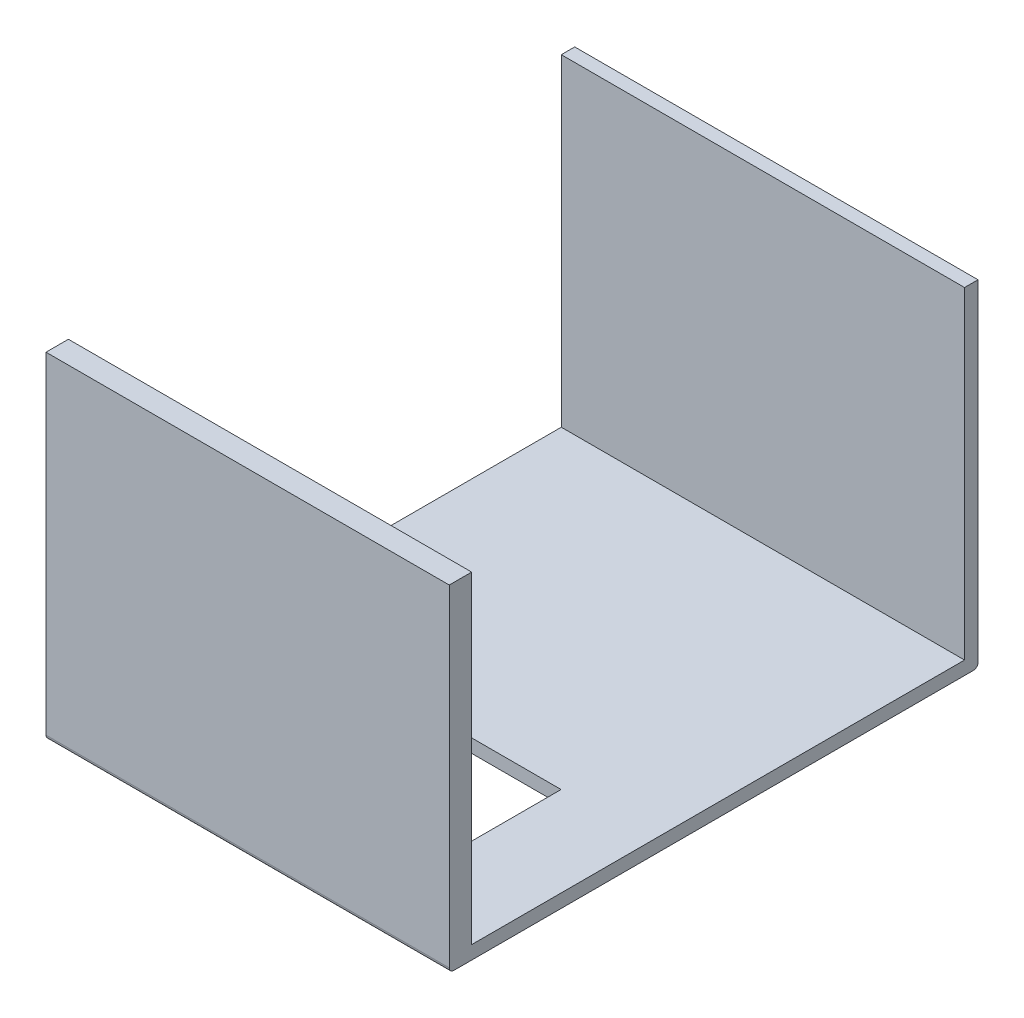
ISO-10303-21;
HEADER;
FILE_DESCRIPTION(('STEP AP214'),'2;1');
FILE_NAME('part.step','',(''),(''),'','','');
FILE_SCHEMA(('AUTOMOTIVE_DESIGN { 1 0 10303 214 1 1 1 1 }'));
ENDSEC;
DATA;
#1=APPLICATION_CONTEXT('core data for automotive mechanical design processes');
#2=APPLICATION_PROTOCOL_DEFINITION('international standard','automotive_design',2000,#1);
#3=PRODUCT_CONTEXT('',#1,'mechanical');
#4=PRODUCT('Part','Part','',(#3));
#5=PRODUCT_RELATED_PRODUCT_CATEGORY('part','',(#4));
#6=PRODUCT_DEFINITION_FORMATION('','',#4);
#7=PRODUCT_DEFINITION_CONTEXT('part definition',#1,'design');
#8=PRODUCT_DEFINITION('design','',#6,#7);
#9=PRODUCT_DEFINITION_SHAPE('','',#8);
#10=(LENGTH_UNIT() NAMED_UNIT(*) SI_UNIT(.MILLI.,.METRE.));
#11=(NAMED_UNIT(*) PLANE_ANGLE_UNIT() SI_UNIT($,.RADIAN.));
#12=(NAMED_UNIT(*) SI_UNIT($,.STERADIAN.) SOLID_ANGLE_UNIT());
#13=UNCERTAINTY_MEASURE_WITH_UNIT(LENGTH_MEASURE(1.E-05),#10,'distance_accuracy_value','');
#14=(GEOMETRIC_REPRESENTATION_CONTEXT(3) GLOBAL_UNCERTAINTY_ASSIGNED_CONTEXT((#13)) GLOBAL_UNIT_ASSIGNED_CONTEXT((#10,
#11,#12)) REPRESENTATION_CONTEXT('',''));
#15=CARTESIAN_POINT('',(0.,0.,0.));
#16=DIRECTION('',(0.,0.,1.));
#17=DIRECTION('',(1.,0.,0.));
#18=AXIS2_PLACEMENT_3D('',#15,#16,#17);
#19=CARTESIAN_POINT('',(0.,3.,0.));
#20=DIRECTION('',(1.,0.,0.));
#21=DIRECTION('',(0.,0.,-1.));
#22=AXIS2_PLACEMENT_3D('',#19,#20,#21);
#23=PLANE('',#22);
#24=DIRECTION('',(0.,0.,1.));
#25=VECTOR('',#24,1.);
#26=CARTESIAN_POINT('',(0.,0.,0.));
#27=LINE('',#26,#25);
#28=CARTESIAN_POINT('',(0.,0.,-112.));
#29=VERTEX_POINT('',#28);
#30=CARTESIAN_POINT('',(0.,0.,4.));
#31=VERTEX_POINT('',#30);
#32=EDGE_CURVE('E214',#29,#31,#27,.T.);
#33=ORIENTED_EDGE('',*,*,#32,.T.);
#34=CARTESIAN_POINT('',(0.,1.,4.));
#35=DIRECTION('',(1.,0.,0.));
#36=DIRECTION('',(0.,0.,-1.));
#37=AXIS2_PLACEMENT_3D('',#34,#35,#36);
#38=CIRCLE('',#37,1.);
#39=CARTESIAN_POINT('',(0.,1.,5.));
#40=VERTEX_POINT('',#39);
#41=EDGE_CURVE('E41',#31,#40,#38,.F.);
#42=ORIENTED_EDGE('',*,*,#41,.T.);
#43=DIRECTION('',(0.,-1.,0.));
#44=VECTOR('',#43,1.);
#45=CARTESIAN_POINT('',(0.,0.,5.));
#46=LINE('',#45,#44);
#47=CARTESIAN_POINT('',(0.,75.,5.));
#48=VERTEX_POINT('',#47);
#49=EDGE_CURVE('E171',#48,#40,#46,.T.);
#50=ORIENTED_EDGE('',*,*,#49,.F.);
#51=DIRECTION('',(0.,0.,-1.));
#52=VECTOR('',#51,1.);
#53=CARTESIAN_POINT('',(0.,75.,5.));
#54=LINE('',#53,#52);
#55=CARTESIAN_POINT('',(0.,75.,0.));
#56=VERTEX_POINT('',#55);
#57=EDGE_CURVE('E179',#48,#56,#54,.T.);
#58=ORIENTED_EDGE('',*,*,#57,.T.);
#59=DIRECTION('',(0.,-1.,0.));
#60=VECTOR('',#59,1.);
#61=CARTESIAN_POINT('',(0.,0.,0.));
#62=LINE('',#61,#60);
#63=CARTESIAN_POINT('',(0.,3.,0.));
#64=VERTEX_POINT('',#63);
#65=EDGE_CURVE('E151',#56,#64,#62,.T.);
#66=ORIENTED_EDGE('',*,*,#65,.T.);
#67=DIRECTION('',(0.,0.,1.));
#68=VECTOR('',#67,1.);
#69=CARTESIAN_POINT('',(0.,3.,0.));
#70=LINE('',#69,#68);
#71=CARTESIAN_POINT('',(0.,3.,-110.));
#72=VERTEX_POINT('',#71);
#73=EDGE_CURVE('E235',#72,#64,#70,.T.);
#74=ORIENTED_EDGE('',*,*,#73,.F.);
#75=DIRECTION('',(0.,1.,0.));
#76=VECTOR('',#75,1.);
#77=CARTESIAN_POINT('',(0.,0.,-110.));
#78=LINE('',#77,#76);
#79=CARTESIAN_POINT('',(0.,75.,-110.));
#80=VERTEX_POINT('',#79);
#81=EDGE_CURVE('E148',#72,#80,#78,.T.);
#82=ORIENTED_EDGE('',*,*,#81,.T.);
#83=DIRECTION('',(0.,0.,1.));
#84=VECTOR('',#83,1.);
#85=CARTESIAN_POINT('',(0.,75.,-113.));
#86=LINE('',#85,#84);
#87=CARTESIAN_POINT('',(0.,75.,-113.));
#88=VERTEX_POINT('',#87);
#89=EDGE_CURVE('E146',#88,#80,#86,.T.);
#90=ORIENTED_EDGE('',*,*,#89,.F.);
#91=DIRECTION('',(0.,1.,0.));
#92=VECTOR('',#91,1.);
#93=CARTESIAN_POINT('',(0.,0.,-113.));
#94=LINE('',#93,#92);
#95=CARTESIAN_POINT('',(0.,1.,-113.));
#96=VERTEX_POINT('',#95);
#97=EDGE_CURVE('E135',#96,#88,#94,.T.);
#98=ORIENTED_EDGE('',*,*,#97,.F.);
#99=CARTESIAN_POINT('',(0.,1.,-112.));
#100=DIRECTION('',(1.,0.,0.));
#101=DIRECTION('',(0.,0.,-1.));
#102=AXIS2_PLACEMENT_3D('',#99,#100,#101);
#103=CIRCLE('',#102,1.);
#104=EDGE_CURVE('E48',#96,#29,#103,.F.);
#105=ORIENTED_EDGE('',*,*,#104,.T.);
#106=EDGE_LOOP('',(#33,#42,#50,#58,#66,#74,#82,#90,#98,#105));
#107=FACE_BOUND('',#106,.T.);
#108=ADVANCED_FACE('F33',(#107),#23,.F.);
#109=CARTESIAN_POINT('',(90.,3.,0.));
#110=DIRECTION('',(-1.,0.,0.));
#111=DIRECTION('',(0.,0.,1.));
#112=AXIS2_PLACEMENT_3D('',#109,#110,#111);
#113=PLANE('',#112);
#114=DIRECTION('',(0.,1.,0.));
#115=VECTOR('',#114,1.);
#116=CARTESIAN_POINT('',(90.,0.,5.));
#117=LINE('',#116,#115);
#118=CARTESIAN_POINT('',(90.,1.,5.));
#119=VERTEX_POINT('',#118);
#120=CARTESIAN_POINT('',(90.,75.,5.));
#121=VERTEX_POINT('',#120);
#122=EDGE_CURVE('E174',#119,#121,#117,.T.);
#123=ORIENTED_EDGE('',*,*,#122,.F.);
#124=CARTESIAN_POINT('',(90.,1.,4.));
#125=DIRECTION('',(-1.,0.,0.));
#126=DIRECTION('',(0.,0.,1.));
#127=AXIS2_PLACEMENT_3D('',#124,#125,#126);
#128=CIRCLE('',#127,1.);
#129=CARTESIAN_POINT('',(90.,0.,4.));
#130=VERTEX_POINT('',#129);
#131=EDGE_CURVE('E247',#119,#130,#128,.F.);
#132=ORIENTED_EDGE('',*,*,#131,.T.);
#133=DIRECTION('',(0.,0.,-1.));
#134=VECTOR('',#133,1.);
#135=CARTESIAN_POINT('',(90.,0.,0.));
#136=LINE('',#135,#134);
#137=CARTESIAN_POINT('',(90.,0.,-112.));
#138=VERTEX_POINT('',#137);
#139=EDGE_CURVE('E234',#130,#138,#136,.T.);
#140=ORIENTED_EDGE('',*,*,#139,.T.);
#141=CARTESIAN_POINT('',(90.,1.,-112.));
#142=DIRECTION('',(-1.,0.,0.));
#143=DIRECTION('',(0.,0.,1.));
#144=AXIS2_PLACEMENT_3D('',#141,#142,#143);
#145=CIRCLE('',#144,1.);
#146=CARTESIAN_POINT('',(90.,1.,-113.));
#147=VERTEX_POINT('',#146);
#148=EDGE_CURVE('E245',#138,#147,#145,.F.);
#149=ORIENTED_EDGE('',*,*,#148,.T.);
#150=DIRECTION('',(0.,-1.,0.));
#151=VECTOR('',#150,1.);
#152=CARTESIAN_POINT('',(90.,0.,-113.));
#153=LINE('',#152,#151);
#154=CARTESIAN_POINT('',(90.,75.,-113.));
#155=VERTEX_POINT('',#154);
#156=EDGE_CURVE('E143',#155,#147,#153,.T.);
#157=ORIENTED_EDGE('',*,*,#156,.F.);
#158=DIRECTION('',(0.,0.,1.));
#159=VECTOR('',#158,1.);
#160=CARTESIAN_POINT('',(90.,75.,-113.));
#161=LINE('',#160,#159);
#162=CARTESIAN_POINT('',(90.,75.,-110.));
#163=VERTEX_POINT('',#162);
#164=EDGE_CURVE('E152',#155,#163,#161,.T.);
#165=ORIENTED_EDGE('',*,*,#164,.T.);
#166=DIRECTION('',(0.,-1.,0.));
#167=VECTOR('',#166,1.);
#168=CARTESIAN_POINT('',(90.,0.,-110.));
#169=LINE('',#168,#167);
#170=CARTESIAN_POINT('',(90.,3.,-110.));
#171=VERTEX_POINT('',#170);
#172=EDGE_CURVE('E166',#163,#171,#169,.T.);
#173=ORIENTED_EDGE('',*,*,#172,.T.);
#174=DIRECTION('',(0.,0.,-1.));
#175=VECTOR('',#174,1.);
#176=CARTESIAN_POINT('',(90.,3.,0.));
#177=LINE('',#176,#175);
#178=CARTESIAN_POINT('',(90.,3.,0.));
#179=VERTEX_POINT('',#178);
#180=EDGE_CURVE('E224',#179,#171,#177,.T.);
#181=ORIENTED_EDGE('',*,*,#180,.F.);
#182=DIRECTION('',(0.,1.,0.));
#183=VECTOR('',#182,1.);
#184=CARTESIAN_POINT('',(90.,0.,0.));
#185=LINE('',#184,#183);
#186=CARTESIAN_POINT('',(90.,75.,0.));
#187=VERTEX_POINT('',#186);
#188=EDGE_CURVE('E185',#179,#187,#185,.T.);
#189=ORIENTED_EDGE('',*,*,#188,.T.);
#190=DIRECTION('',(0.,0.,-1.));
#191=VECTOR('',#190,1.);
#192=CARTESIAN_POINT('',(90.,75.,5.));
#193=LINE('',#192,#191);
#194=EDGE_CURVE('E190',#121,#187,#193,.T.);
#195=ORIENTED_EDGE('',*,*,#194,.F.);
#196=EDGE_LOOP('',(#123,#132,#140,#149,#157,#165,#173,#181,#189,#195));
#197=FACE_BOUND('',#196,.T.);
#198=ADVANCED_FACE('F264',(#197),#113,.F.);
#199=CARTESIAN_POINT('',(0.,3.,0.));
#200=DIRECTION('',(0.,-1.,0.));
#201=DIRECTION('',(0.,0.,-1.));
#202=AXIS2_PLACEMENT_3D('',#199,#200,#201);
#203=PLANE('',#202);
#204=DIRECTION('',(1.,0.,0.));
#205=VECTOR('',#204,1.);
#206=CARTESIAN_POINT('',(0.,3.,0.));
#207=LINE('',#206,#205);
#208=CARTESIAN_POINT('',(20.,3.,0.));
#209=VERTEX_POINT('',#208);
#210=EDGE_CURVE('E222',#64,#209,#207,.T.);
#211=ORIENTED_EDGE('',*,*,#210,.T.);
#212=DIRECTION('',(0.,0.,1.));
#213=VECTOR('',#212,1.);
#214=CARTESIAN_POINT('',(20.,3.,0.));
#215=LINE('',#214,#213);
#216=CARTESIAN_POINT('',(20.,3.,-39.9514874047836));
#217=VERTEX_POINT('',#216);
#218=EDGE_CURVE('E193',#217,#209,#215,.T.);
#219=ORIENTED_EDGE('',*,*,#218,.F.);
#220=DIRECTION('',(-1.,0.,0.));
#221=VECTOR('',#220,1.);
#222=CARTESIAN_POINT('',(20.,3.,-39.9514874047836));
#223=LINE('',#222,#221);
#224=CARTESIAN_POINT('',(70.,3.,-39.9514874047836));
#225=VERTEX_POINT('',#224);
#226=EDGE_CURVE('E198',#225,#217,#223,.T.);
#227=ORIENTED_EDGE('',*,*,#226,.F.);
#228=DIRECTION('',(0.,0.,-1.));
#229=VECTOR('',#228,1.);
#230=CARTESIAN_POINT('',(70.,3.,0.));
#231=LINE('',#230,#229);
#232=CARTESIAN_POINT('',(70.,3.,0.));
#233=VERTEX_POINT('',#232);
#234=EDGE_CURVE('E207',#233,#225,#231,.T.);
#235=ORIENTED_EDGE('',*,*,#234,.F.);
#236=EDGE_CURVE('E225',#233,#179,#207,.T.);
#237=ORIENTED_EDGE('',*,*,#236,.T.);
#238=ORIENTED_EDGE('',*,*,#180,.T.);
#239=DIRECTION('',(-1.,0.,0.));
#240=VECTOR('',#239,1.);
#241=CARTESIAN_POINT('',(0.,3.,-110.));
#242=LINE('',#241,#240);
#243=EDGE_CURVE('E230',#171,#72,#242,.T.);
#244=ORIENTED_EDGE('',*,*,#243,.T.);
#245=ORIENTED_EDGE('',*,*,#73,.T.);
#246=EDGE_LOOP('',(#211,#219,#227,#235,#237,#238,#244,#245));
#247=FACE_BOUND('',#246,.T.);
#248=ADVANCED_FACE('F273',(#247),#203,.F.);
#249=CARTESIAN_POINT('',(0.,0.,0.));
#250=DIRECTION('',(0.,-1.,0.));
#251=DIRECTION('',(0.,0.,-1.));
#252=AXIS2_PLACEMENT_3D('',#249,#250,#251);
#253=PLANE('',#252);
#254=DIRECTION('',(0.,0.,1.));
#255=VECTOR('',#254,1.);
#256=CARTESIAN_POINT('',(20.,0.,0.));
#257=LINE('',#256,#255);
#258=CARTESIAN_POINT('',(20.,0.,-39.9514874047836));
#259=VERTEX_POINT('',#258);
#260=CARTESIAN_POINT('',(20.,0.,0.));
#261=VERTEX_POINT('',#260);
#262=EDGE_CURVE('E194',#259,#261,#257,.T.);
#263=ORIENTED_EDGE('',*,*,#262,.T.);
#264=DIRECTION('',(1.,0.,0.));
#265=VECTOR('',#264,1.);
#266=CARTESIAN_POINT('',(0.,0.,0.));
#267=LINE('',#266,#265);
#268=CARTESIAN_POINT('',(70.,0.,0.));
#269=VERTEX_POINT('',#268);
#270=EDGE_CURVE('E182',#261,#269,#267,.T.);
#271=ORIENTED_EDGE('',*,*,#270,.T.);
#272=DIRECTION('',(0.,0.,-1.));
#273=VECTOR('',#272,1.);
#274=CARTESIAN_POINT('',(70.,0.,0.));
#275=LINE('',#274,#273);
#276=CARTESIAN_POINT('',(70.,0.,-39.9514874047836));
#277=VERTEX_POINT('',#276);
#278=EDGE_CURVE('E197',#269,#277,#275,.T.);
#279=ORIENTED_EDGE('',*,*,#278,.T.);
#280=DIRECTION('',(-1.,0.,0.));
#281=VECTOR('',#280,1.);
#282=CARTESIAN_POINT('',(20.,0.,-39.9514874047836));
#283=LINE('',#282,#281);
#284=EDGE_CURVE('E201',#277,#259,#283,.T.);
#285=ORIENTED_EDGE('',*,*,#284,.T.);
#286=EDGE_LOOP('',(#263,#271,#279,#285));
#287=FACE_BOUND('',#286,.T.);
#288=ORIENTED_EDGE('',*,*,#139,.F.);
#289=DIRECTION('',(1.,0.,0.));
#290=VECTOR('',#289,1.);
#291=CARTESIAN_POINT('',(0.,0.,4.));
#292=LINE('',#291,#290);
#293=EDGE_CURVE('E55',#130,#31,#292,.F.);
#294=ORIENTED_EDGE('',*,*,#293,.T.);
#295=ORIENTED_EDGE('',*,*,#32,.F.);
#296=DIRECTION('',(-1.,0.,0.));
#297=VECTOR('',#296,1.);
#298=CARTESIAN_POINT('',(90.,0.,-112.));
#299=LINE('',#298,#297);
#300=EDGE_CURVE('E249',#29,#138,#299,.F.);
#301=ORIENTED_EDGE('',*,*,#300,.T.);
#302=EDGE_LOOP('',(#288,#294,#295,#301));
#303=FACE_BOUND('',#302,.T.);
#304=ADVANCED_FACE('F267',(#287,#303),#253,.T.);
#305=CARTESIAN_POINT('',(20.,0.,0.));
#306=DIRECTION('',(-1.,0.,0.));
#307=DIRECTION('',(0.,0.,1.));
#308=AXIS2_PLACEMENT_3D('',#305,#306,#307);
#309=PLANE('',#308);
#310=ORIENTED_EDGE('',*,*,#218,.T.);
#311=DIRECTION('',(0.,1.,0.));
#312=VECTOR('',#311,1.);
#313=CARTESIAN_POINT('',(20.,0.,0.));
#314=LINE('',#313,#312);
#315=EDGE_CURVE('E204',#261,#209,#314,.T.);
#316=ORIENTED_EDGE('',*,*,#315,.F.);
#317=ORIENTED_EDGE('',*,*,#262,.F.);
#318=DIRECTION('',(0.,1.,0.));
#319=VECTOR('',#318,1.);
#320=CARTESIAN_POINT('',(20.,0.,-39.9514874047836));
#321=LINE('',#320,#319);
#322=EDGE_CURVE('E212',#259,#217,#321,.T.);
#323=ORIENTED_EDGE('',*,*,#322,.T.);
#324=EDGE_LOOP('',(#310,#316,#317,#323));
#325=FACE_BOUND('',#324,.T.);
#326=ADVANCED_FACE('F284',(#325),#309,.F.);
#327=CARTESIAN_POINT('',(20.,0.,-39.9514874047836));
#328=DIRECTION('',(0.,0.,-1.));
#329=DIRECTION('',(-1.,0.,0.));
#330=AXIS2_PLACEMENT_3D('',#327,#328,#329);
#331=PLANE('',#330);
#332=ORIENTED_EDGE('',*,*,#226,.T.);
#333=ORIENTED_EDGE('',*,*,#322,.F.);
#334=ORIENTED_EDGE('',*,*,#284,.F.);
#335=DIRECTION('',(0.,1.,0.));
#336=VECTOR('',#335,1.);
#337=CARTESIAN_POINT('',(70.,0.,-39.9514874047836));
#338=LINE('',#337,#336);
#339=EDGE_CURVE('E215',#277,#225,#338,.T.);
#340=ORIENTED_EDGE('',*,*,#339,.T.);
#341=EDGE_LOOP('',(#332,#333,#334,#340));
#342=FACE_BOUND('',#341,.T.);
#343=ADVANCED_FACE('F287',(#342),#331,.F.);
#344=CARTESIAN_POINT('',(70.,0.,0.));
#345=DIRECTION('',(1.,0.,0.));
#346=DIRECTION('',(0.,0.,-1.));
#347=AXIS2_PLACEMENT_3D('',#344,#345,#346);
#348=PLANE('',#347);
#349=ORIENTED_EDGE('',*,*,#234,.T.);
#350=ORIENTED_EDGE('',*,*,#339,.F.);
#351=ORIENTED_EDGE('',*,*,#278,.F.);
#352=DIRECTION('',(0.,1.,0.));
#353=VECTOR('',#352,1.);
#354=CARTESIAN_POINT('',(70.,0.,0.));
#355=LINE('',#354,#353);
#356=EDGE_CURVE('E217',#269,#233,#355,.T.);
#357=ORIENTED_EDGE('',*,*,#356,.T.);
#358=EDGE_LOOP('',(#349,#350,#351,#357));
#359=FACE_BOUND('',#358,.T.);
#360=ADVANCED_FACE('F291',(#359),#348,.F.);
#361=CARTESIAN_POINT('',(0.,0.,0.));
#362=DIRECTION('',(0.,0.,-1.));
#363=DIRECTION('',(-1.,0.,0.));
#364=AXIS2_PLACEMENT_3D('',#361,#362,#363);
#365=PLANE('',#364);
#366=ORIENTED_EDGE('',*,*,#210,.F.);
#367=ORIENTED_EDGE('',*,*,#65,.F.);
#368=DIRECTION('',(-1.,0.,0.));
#369=VECTOR('',#368,1.);
#370=CARTESIAN_POINT('',(0.,75.,0.));
#371=LINE('',#370,#369);
#372=EDGE_CURVE('E175',#187,#56,#371,.T.);
#373=ORIENTED_EDGE('',*,*,#372,.F.);
#374=ORIENTED_EDGE('',*,*,#188,.F.);
#375=ORIENTED_EDGE('',*,*,#236,.F.);
#376=ORIENTED_EDGE('',*,*,#356,.F.);
#377=ORIENTED_EDGE('',*,*,#270,.F.);
#378=ORIENTED_EDGE('',*,*,#315,.T.);
#379=EDGE_LOOP('',(#366,#367,#373,#374,#375,#376,#377,#378));
#380=FACE_BOUND('',#379,.T.);
#381=ADVANCED_FACE('F279',(#380),#365,.T.);
#382=CARTESIAN_POINT('',(0.,75.,5.));
#383=DIRECTION('',(0.,-1.,0.));
#384=DIRECTION('',(0.,0.,-1.));
#385=AXIS2_PLACEMENT_3D('',#382,#383,#384);
#386=PLANE('',#385);
#387=ORIENTED_EDGE('',*,*,#372,.T.);
#388=ORIENTED_EDGE('',*,*,#57,.F.);
#389=DIRECTION('',(-1.,0.,0.));
#390=VECTOR('',#389,1.);
#391=CARTESIAN_POINT('',(0.,75.,5.));
#392=LINE('',#391,#390);
#393=EDGE_CURVE('E177',#121,#48,#392,.T.);
#394=ORIENTED_EDGE('',*,*,#393,.F.);
#395=ORIENTED_EDGE('',*,*,#194,.T.);
#396=EDGE_LOOP('',(#387,#388,#394,#395));
#397=FACE_BOUND('',#396,.T.);
#398=ADVANCED_FACE('F323',(#397),#386,.F.);
#399=CARTESIAN_POINT('',(0.,0.,5.));
#400=DIRECTION('',(0.,0.,-1.));
#401=DIRECTION('',(-1.,0.,0.));
#402=AXIS2_PLACEMENT_3D('',#399,#400,#401);
#403=PLANE('',#402);
#404=ORIENTED_EDGE('',*,*,#49,.T.);
#405=DIRECTION('',(1.,0.,0.));
#406=VECTOR('',#405,1.);
#407=CARTESIAN_POINT('',(90.,1.,5.));
#408=LINE('',#407,#406);
#409=EDGE_CURVE('E233',#40,#119,#408,.T.);
#410=ORIENTED_EDGE('',*,*,#409,.T.);
#411=ORIENTED_EDGE('',*,*,#122,.T.);
#412=ORIENTED_EDGE('',*,*,#393,.T.);
#413=EDGE_LOOP('',(#404,#410,#411,#412));
#414=FACE_BOUND('',#413,.T.);
#415=ADVANCED_FACE('F257',(#414),#403,.F.);
#416=CARTESIAN_POINT('',(0.,0.,-110.));
#417=DIRECTION('',(0.,0.,1.));
#418=DIRECTION('',(1.,0.,0.));
#419=AXIS2_PLACEMENT_3D('',#416,#417,#418);
#420=PLANE('',#419);
#421=ORIENTED_EDGE('',*,*,#243,.F.);
#422=ORIENTED_EDGE('',*,*,#172,.F.);
#423=DIRECTION('',(1.,0.,0.));
#424=VECTOR('',#423,1.);
#425=CARTESIAN_POINT('',(90.,75.,-110.));
#426=LINE('',#425,#424);
#427=EDGE_CURVE('E170',#80,#163,#426,.T.);
#428=ORIENTED_EDGE('',*,*,#427,.F.);
#429=ORIENTED_EDGE('',*,*,#81,.F.);
#430=EDGE_LOOP('',(#421,#422,#428,#429));
#431=FACE_BOUND('',#430,.T.);
#432=ADVANCED_FACE('F271',(#431),#420,.T.);
#433=CARTESIAN_POINT('',(90.,75.,-113.));
#434=DIRECTION('',(0.,-1.,0.));
#435=DIRECTION('',(0.,0.,-1.));
#436=AXIS2_PLACEMENT_3D('',#433,#434,#435);
#437=PLANE('',#436);
#438=ORIENTED_EDGE('',*,*,#427,.T.);
#439=ORIENTED_EDGE('',*,*,#164,.F.);
#440=DIRECTION('',(1.,0.,0.));
#441=VECTOR('',#440,1.);
#442=CARTESIAN_POINT('',(90.,75.,-113.));
#443=LINE('',#442,#441);
#444=EDGE_CURVE('E140',#88,#155,#443,.T.);
#445=ORIENTED_EDGE('',*,*,#444,.F.);
#446=ORIENTED_EDGE('',*,*,#89,.T.);
#447=EDGE_LOOP('',(#438,#439,#445,#446));
#448=FACE_BOUND('',#447,.T.);
#449=ADVANCED_FACE('F154',(#448),#437,.F.);
#450=CARTESIAN_POINT('',(0.,0.,-113.));
#451=DIRECTION('',(0.,0.,1.));
#452=DIRECTION('',(1.,0.,0.));
#453=AXIS2_PLACEMENT_3D('',#450,#451,#452);
#454=PLANE('',#453);
#455=ORIENTED_EDGE('',*,*,#156,.T.);
#456=DIRECTION('',(-1.,0.,0.));
#457=VECTOR('',#456,1.);
#458=CARTESIAN_POINT('',(0.,1.,-113.));
#459=LINE('',#458,#457);
#460=EDGE_CURVE('E11',#147,#96,#459,.T.);
#461=ORIENTED_EDGE('',*,*,#460,.T.);
#462=ORIENTED_EDGE('',*,*,#97,.T.);
#463=ORIENTED_EDGE('',*,*,#444,.T.);
#464=EDGE_LOOP('',(#455,#461,#462,#463));
#465=FACE_BOUND('',#464,.T.);
#466=ADVANCED_FACE('F138',(#465),#454,.F.);
#467=CARTESIAN_POINT('',(0.,1.,4.));
#468=DIRECTION('',(-1.,0.,0.));
#469=DIRECTION('',(0.,0.,1.));
#470=AXIS2_PLACEMENT_3D('',#467,#468,#469);
#471=CYLINDRICAL_SURFACE('',#470,1.);
#472=ORIENTED_EDGE('',*,*,#41,.F.);
#473=ORIENTED_EDGE('',*,*,#293,.F.);
#474=ORIENTED_EDGE('',*,*,#131,.F.);
#475=ORIENTED_EDGE('',*,*,#409,.F.);
#476=EDGE_LOOP('',(#472,#473,#474,#475));
#477=FACE_BOUND('',#476,.T.);
#478=ADVANCED_FACE('F261',(#477),#471,.T.);
#479=CARTESIAN_POINT('',(0.,1.,-112.));
#480=DIRECTION('',(1.,0.,0.));
#481=DIRECTION('',(0.,0.,-1.));
#482=AXIS2_PLACEMENT_3D('',#479,#480,#481);
#483=CYLINDRICAL_SURFACE('',#482,1.);
#484=ORIENTED_EDGE('',*,*,#148,.F.);
#485=ORIENTED_EDGE('',*,*,#300,.F.);
#486=ORIENTED_EDGE('',*,*,#104,.F.);
#487=ORIENTED_EDGE('',*,*,#460,.F.);
#488=EDGE_LOOP('',(#484,#485,#486,#487));
#489=FACE_BOUND('',#488,.T.);
#490=ADVANCED_FACE('F35',(#489),#483,.T.);
#491=CLOSED_SHELL('',(#108,#198,#248,#304,#326,#343,#360,#381,#398,#415,#432,#449,#466,#478,#490));
#492=MANIFOLD_SOLID_BREP('B2',#491);
#493=ADVANCED_BREP_SHAPE_REPRESENTATION('',(#18,#492),#14);
#494=SHAPE_DEFINITION_REPRESENTATION(#9,#493);
ENDSEC;
END-ISO-10303-21;
